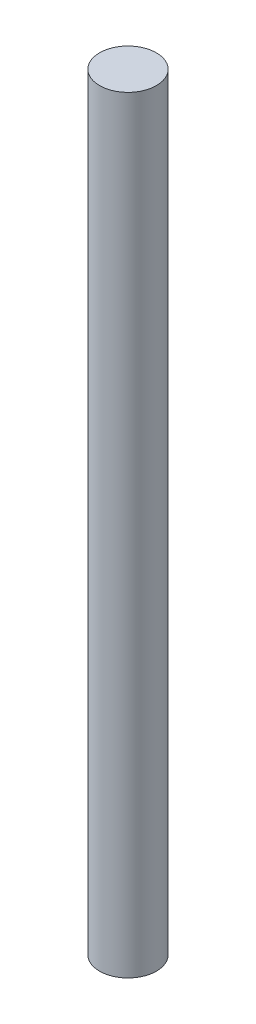
ISO-10303-21;
HEADER;
FILE_DESCRIPTION(('STEP AP214'),'2;1');
FILE_NAME('part.step','',(''),(''),'','','');
FILE_SCHEMA(('AUTOMOTIVE_DESIGN { 1 0 10303 214 1 1 1 1 }'));
ENDSEC;
DATA;
#1=APPLICATION_CONTEXT('core data for automotive mechanical design processes');
#2=APPLICATION_PROTOCOL_DEFINITION('international standard','automotive_design',2000,#1);
#3=PRODUCT_CONTEXT('',#1,'mechanical');
#4=PRODUCT('Part','Part','',(#3));
#5=PRODUCT_RELATED_PRODUCT_CATEGORY('part','',(#4));
#6=PRODUCT_DEFINITION_FORMATION('','',#4);
#7=PRODUCT_DEFINITION_CONTEXT('part definition',#1,'design');
#8=PRODUCT_DEFINITION('design','',#6,#7);
#9=PRODUCT_DEFINITION_SHAPE('','',#8);
#10=(LENGTH_UNIT() NAMED_UNIT(*) SI_UNIT(.MILLI.,.METRE.));
#11=(NAMED_UNIT(*) PLANE_ANGLE_UNIT() SI_UNIT($,.RADIAN.));
#12=(NAMED_UNIT(*) SI_UNIT($,.STERADIAN.) SOLID_ANGLE_UNIT());
#13=UNCERTAINTY_MEASURE_WITH_UNIT(LENGTH_MEASURE(1.E-05),#10,'distance_accuracy_value','');
#14=(GEOMETRIC_REPRESENTATION_CONTEXT(3) GLOBAL_UNCERTAINTY_ASSIGNED_CONTEXT((#13)) GLOBAL_UNIT_ASSIGNED_CONTEXT((#10,
#11,#12)) REPRESENTATION_CONTEXT('',''));
#15=CARTESIAN_POINT('',(0.,0.,0.));
#16=DIRECTION('',(0.,0.,1.));
#17=DIRECTION('',(1.,0.,0.));
#18=AXIS2_PLACEMENT_3D('',#15,#16,#17);
#19=CARTESIAN_POINT('',(0.,40.5,0.));
#20=DIRECTION('',(0.,-1.,0.));
#21=DIRECTION('',(0.,0.,-1.));
#22=AXIS2_PLACEMENT_3D('',#19,#20,#21);
#23=CYLINDRICAL_SURFACE('',#22,1.5);
#24=CARTESIAN_POINT('',(0.,40.5,0.));
#25=DIRECTION('',(0.,1.,0.));
#26=DIRECTION('',(0.,0.,1.));
#27=AXIS2_PLACEMENT_3D('',#24,#25,#26);
#28=CIRCLE('',#27,1.5);
#29=CARTESIAN_POINT('',(0.,40.5,1.5));
#30=VERTEX_POINT('',#29);
#31=EDGE_CURVE('E10',#30,#30,#28,.T.);
#32=ORIENTED_EDGE('',*,*,#31,.F.);
#33=EDGE_LOOP('',(#32));
#34=FACE_BOUND('',#33,.T.);
#35=CARTESIAN_POINT('',(0.,0.,0.));
#36=DIRECTION('',(0.,1.,0.));
#37=DIRECTION('',(0.,0.,1.));
#38=AXIS2_PLACEMENT_3D('',#35,#36,#37);
#39=CIRCLE('',#38,1.5);
#40=CARTESIAN_POINT('',(0.,0.,1.5));
#41=VERTEX_POINT('',#40);
#42=EDGE_CURVE('E33',#41,#41,#39,.T.);
#43=ORIENTED_EDGE('',*,*,#42,.T.);
#44=EDGE_LOOP('',(#43));
#45=FACE_BOUND('',#44,.T.);
#46=ADVANCED_FACE('F30',(#34,#45),#23,.T.);
#47=CARTESIAN_POINT('',(0.,40.5,0.));
#48=DIRECTION('',(0.,1.,0.));
#49=DIRECTION('',(0.,0.,1.));
#50=AXIS2_PLACEMENT_3D('',#47,#48,#49);
#51=PLANE('',#50);
#52=ORIENTED_EDGE('',*,*,#31,.T.);
#53=EDGE_LOOP('',(#52));
#54=FACE_BOUND('',#53,.T.);
#55=ADVANCED_FACE('F45',(#54),#51,.T.);
#56=CARTESIAN_POINT('',(0.,0.,0.));
#57=DIRECTION('',(0.,1.,0.));
#58=DIRECTION('',(0.,0.,1.));
#59=AXIS2_PLACEMENT_3D('',#56,#57,#58);
#60=PLANE('',#59);
#61=ORIENTED_EDGE('',*,*,#42,.F.);
#62=EDGE_LOOP('',(#61));
#63=FACE_BOUND('',#62,.T.);
#64=ADVANCED_FACE('F43',(#63),#60,.F.);
#65=CLOSED_SHELL('',(#46,#55,#64));
#66=MANIFOLD_SOLID_BREP('B2',#65);
#67=ADVANCED_BREP_SHAPE_REPRESENTATION('',(#18,#66),#14);
#68=SHAPE_DEFINITION_REPRESENTATION(#9,#67);
ENDSEC;
END-ISO-10303-21;
